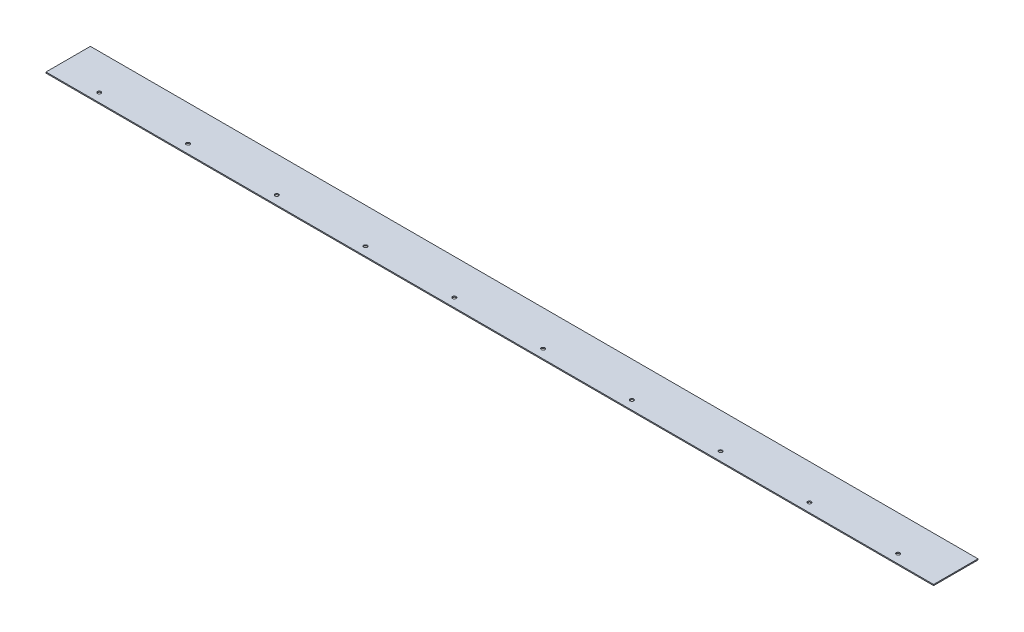
ISO-10303-21;
HEADER;
FILE_DESCRIPTION(('STEP AP214'),'2;1');
FILE_NAME('part.step','',(''),(''),'','','');
FILE_SCHEMA(('AUTOMOTIVE_DESIGN { 1 0 10303 214 1 1 1 1 }'));
ENDSEC;
DATA;
#1=APPLICATION_CONTEXT('core data for automotive mechanical design processes');
#2=APPLICATION_PROTOCOL_DEFINITION('international standard','automotive_design',2000,#1);
#3=PRODUCT_CONTEXT('',#1,'mechanical');
#4=PRODUCT('Part','Part','',(#3));
#5=PRODUCT_RELATED_PRODUCT_CATEGORY('part','',(#4));
#6=PRODUCT_DEFINITION_FORMATION('','',#4);
#7=PRODUCT_DEFINITION_CONTEXT('part definition',#1,'design');
#8=PRODUCT_DEFINITION('design','',#6,#7);
#9=PRODUCT_DEFINITION_SHAPE('','',#8);
#10=(LENGTH_UNIT() NAMED_UNIT(*) SI_UNIT(.MILLI.,.METRE.));
#11=(NAMED_UNIT(*) PLANE_ANGLE_UNIT() SI_UNIT($,.RADIAN.));
#12=(NAMED_UNIT(*) SI_UNIT($,.STERADIAN.) SOLID_ANGLE_UNIT());
#13=UNCERTAINTY_MEASURE_WITH_UNIT(LENGTH_MEASURE(1.E-05),#10,'distance_accuracy_value','');
#14=(GEOMETRIC_REPRESENTATION_CONTEXT(3) GLOBAL_UNCERTAINTY_ASSIGNED_CONTEXT((#13)) GLOBAL_UNIT_ASSIGNED_CONTEXT((#10,
#11,#12)) REPRESENTATION_CONTEXT('',''));
#15=CARTESIAN_POINT('',(0.,0.,0.));
#16=DIRECTION('',(0.,0.,1.));
#17=DIRECTION('',(1.,0.,0.));
#18=AXIS2_PLACEMENT_3D('',#15,#16,#17);
#19=CARTESIAN_POINT('',(500.,-1.2,25.));
#20=DIRECTION('',(1.,0.,0.));
#21=DIRECTION('',(0.,0.,-1.));
#22=AXIS2_PLACEMENT_3D('',#19,#20,#21);
#23=PLANE('',#22);
#24=DIRECTION('',(0.,0.,-1.));
#25=VECTOR('',#24,1.);
#26=CARTESIAN_POINT('',(500.,0.,25.));
#27=LINE('',#26,#25);
#28=CARTESIAN_POINT('',(500.,0.,25.));
#29=VERTEX_POINT('',#28);
#30=CARTESIAN_POINT('',(500.,0.,-25.));
#31=VERTEX_POINT('',#30);
#32=EDGE_CURVE('E103',#29,#31,#27,.T.);
#33=ORIENTED_EDGE('',*,*,#32,.F.);
#34=DIRECTION('',(0.,1.,0.));
#35=VECTOR('',#34,1.);
#36=CARTESIAN_POINT('',(500.,-1.2,25.));
#37=LINE('',#36,#35);
#38=CARTESIAN_POINT('',(500.,-1.2,25.));
#39=VERTEX_POINT('',#38);
#40=EDGE_CURVE('E11',#39,#29,#37,.T.);
#41=ORIENTED_EDGE('',*,*,#40,.F.);
#42=DIRECTION('',(0.,0.,-1.));
#43=VECTOR('',#42,1.);
#44=CARTESIAN_POINT('',(500.,-1.2,25.));
#45=LINE('',#44,#43);
#46=CARTESIAN_POINT('',(500.,-1.2,-25.));
#47=VERTEX_POINT('',#46);
#48=EDGE_CURVE('E96',#39,#47,#45,.T.);
#49=ORIENTED_EDGE('',*,*,#48,.T.);
#50=DIRECTION('',(0.,1.,0.));
#51=VECTOR('',#50,1.);
#52=CARTESIAN_POINT('',(500.,-1.2,-25.));
#53=LINE('',#52,#51);
#54=EDGE_CURVE('E41',#47,#31,#53,.T.);
#55=ORIENTED_EDGE('',*,*,#54,.T.);
#56=EDGE_LOOP('',(#33,#41,#49,#55));
#57=FACE_BOUND('',#56,.T.);
#58=ADVANCED_FACE('F38',(#57),#23,.T.);
#59=CARTESIAN_POINT('',(-500.,-1.2,25.));
#60=DIRECTION('',(0.,0.,1.));
#61=DIRECTION('',(1.,0.,0.));
#62=AXIS2_PLACEMENT_3D('',#59,#60,#61);
#63=PLANE('',#62);
#64=DIRECTION('',(1.,0.,0.));
#65=VECTOR('',#64,1.);
#66=CARTESIAN_POINT('',(-500.,0.,25.));
#67=LINE('',#66,#65);
#68=CARTESIAN_POINT('',(-500.,0.,25.));
#69=VERTEX_POINT('',#68);
#70=EDGE_CURVE('E98',#69,#29,#67,.T.);
#71=ORIENTED_EDGE('',*,*,#70,.F.);
#72=DIRECTION('',(0.,1.,0.));
#73=VECTOR('',#72,1.);
#74=CARTESIAN_POINT('',(-500.,-1.2,25.));
#75=LINE('',#74,#73);
#76=CARTESIAN_POINT('',(-500.,-1.2,25.));
#77=VERTEX_POINT('',#76);
#78=EDGE_CURVE('E47',#77,#69,#75,.T.);
#79=ORIENTED_EDGE('',*,*,#78,.F.);
#80=DIRECTION('',(1.,0.,0.));
#81=VECTOR('',#80,1.);
#82=CARTESIAN_POINT('',(-500.,-1.2,25.));
#83=LINE('',#82,#81);
#84=EDGE_CURVE('E93',#77,#39,#83,.T.);
#85=ORIENTED_EDGE('',*,*,#84,.T.);
#86=ORIENTED_EDGE('',*,*,#40,.T.);
#87=EDGE_LOOP('',(#71,#79,#85,#86));
#88=FACE_BOUND('',#87,.T.);
#89=ADVANCED_FACE('F114',(#88),#63,.T.);
#90=CARTESIAN_POINT('',(-500.,-1.2,25.));
#91=DIRECTION('',(-1.,0.,0.));
#92=DIRECTION('',(0.,0.,1.));
#93=AXIS2_PLACEMENT_3D('',#90,#91,#92);
#94=PLANE('',#93);
#95=DIRECTION('',(0.,0.,1.));
#96=VECTOR('',#95,1.);
#97=CARTESIAN_POINT('',(-500.,0.,25.));
#98=LINE('',#97,#96);
#99=CARTESIAN_POINT('',(-500.,0.,-25.));
#100=VERTEX_POINT('',#99);
#101=EDGE_CURVE('E88',#100,#69,#98,.T.);
#102=ORIENTED_EDGE('',*,*,#101,.F.);
#103=DIRECTION('',(0.,1.,0.));
#104=VECTOR('',#103,1.);
#105=CARTESIAN_POINT('',(-500.,-1.2,-25.));
#106=LINE('',#105,#104);
#107=CARTESIAN_POINT('',(-500.,-1.2,-25.));
#108=VERTEX_POINT('',#107);
#109=EDGE_CURVE('E83',#108,#100,#106,.T.);
#110=ORIENTED_EDGE('',*,*,#109,.F.);
#111=DIRECTION('',(0.,0.,1.));
#112=VECTOR('',#111,1.);
#113=CARTESIAN_POINT('',(-500.,-1.2,25.));
#114=LINE('',#113,#112);
#115=EDGE_CURVE('E86',#108,#77,#114,.T.);
#116=ORIENTED_EDGE('',*,*,#115,.T.);
#117=ORIENTED_EDGE('',*,*,#78,.T.);
#118=EDGE_LOOP('',(#102,#110,#116,#117));
#119=FACE_BOUND('',#118,.T.);
#120=ADVANCED_FACE('F85',(#119),#94,.T.);
#121=CARTESIAN_POINT('',(-500.,-1.2,-25.));
#122=DIRECTION('',(0.,0.,-1.));
#123=DIRECTION('',(-1.,0.,0.));
#124=AXIS2_PLACEMENT_3D('',#121,#122,#123);
#125=PLANE('',#124);
#126=DIRECTION('',(-1.,0.,0.));
#127=VECTOR('',#126,1.);
#128=CARTESIAN_POINT('',(-500.,0.,-25.));
#129=LINE('',#128,#127);
#130=EDGE_CURVE('E106',#31,#100,#129,.T.);
#131=ORIENTED_EDGE('',*,*,#130,.F.);
#132=ORIENTED_EDGE('',*,*,#54,.F.);
#133=DIRECTION('',(-1.,0.,0.));
#134=VECTOR('',#133,1.);
#135=CARTESIAN_POINT('',(-500.,-1.2,-25.));
#136=LINE('',#135,#134);
#137=EDGE_CURVE('E92',#47,#108,#136,.T.);
#138=ORIENTED_EDGE('',*,*,#137,.T.);
#139=ORIENTED_EDGE('',*,*,#109,.T.);
#140=EDGE_LOOP('',(#131,#132,#138,#139));
#141=FACE_BOUND('',#140,.T.);
#142=ADVANCED_FACE('F95',(#141),#125,.T.);
#143=CARTESIAN_POINT('',(0.,-1.2,0.));
#144=DIRECTION('',(0.,-1.,0.));
#145=DIRECTION('',(0.,0.,-1.));
#146=AXIS2_PLACEMENT_3D('',#143,#144,#145);
#147=PLANE('',#146);
#148=CARTESIAN_POINT('',(450.,-1.2,15.));
#149=DIRECTION('',(0.,-1.,0.));
#150=DIRECTION('',(0.,0.,-1.));
#151=AXIS2_PLACEMENT_3D('',#148,#149,#150);
#152=CIRCLE('',#151,2.);
#153=CARTESIAN_POINT('',(450.,-1.2,13.));
#154=VERTEX_POINT('',#153);
#155=EDGE_CURVE('E107',#154,#154,#152,.T.);
#156=ORIENTED_EDGE('',*,*,#155,.F.);
#157=EDGE_LOOP('',(#156));
#158=FACE_BOUND('',#157,.T.);
#159=CARTESIAN_POINT('',(350.,-1.2,15.));
#160=DIRECTION('',(0.,-1.,0.));
#161=DIRECTION('',(0.,0.,-1.));
#162=AXIS2_PLACEMENT_3D('',#159,#160,#161);
#163=CIRCLE('',#162,2.);
#164=CARTESIAN_POINT('',(350.,-1.2,13.));
#165=VERTEX_POINT('',#164);
#166=EDGE_CURVE('E236',#165,#165,#163,.T.);
#167=ORIENTED_EDGE('',*,*,#166,.F.);
#168=EDGE_LOOP('',(#167));
#169=FACE_BOUND('',#168,.T.);
#170=CARTESIAN_POINT('',(250.,-1.2,15.));
#171=DIRECTION('',(0.,-1.,0.));
#172=DIRECTION('',(0.,0.,-1.));
#173=AXIS2_PLACEMENT_3D('',#170,#171,#172);
#174=CIRCLE('',#173,2.);
#175=CARTESIAN_POINT('',(250.,-1.2,13.));
#176=VERTEX_POINT('',#175);
#177=EDGE_CURVE('E233',#176,#176,#174,.T.);
#178=ORIENTED_EDGE('',*,*,#177,.F.);
#179=EDGE_LOOP('',(#178));
#180=FACE_BOUND('',#179,.T.);
#181=CARTESIAN_POINT('',(150.,-1.2,15.));
#182=DIRECTION('',(0.,-1.,0.));
#183=DIRECTION('',(0.,0.,-1.));
#184=AXIS2_PLACEMENT_3D('',#181,#182,#183);
#185=CIRCLE('',#184,2.);
#186=CARTESIAN_POINT('',(150.,-1.2,13.));
#187=VERTEX_POINT('',#186);
#188=EDGE_CURVE('E230',#187,#187,#185,.T.);
#189=ORIENTED_EDGE('',*,*,#188,.F.);
#190=EDGE_LOOP('',(#189));
#191=FACE_BOUND('',#190,.T.);
#192=CARTESIAN_POINT('',(49.9999999999999,-1.2,15.));
#193=DIRECTION('',(0.,-1.,0.));
#194=DIRECTION('',(0.,0.,-1.));
#195=AXIS2_PLACEMENT_3D('',#192,#193,#194);
#196=CIRCLE('',#195,2.);
#197=CARTESIAN_POINT('',(49.9999999999999,-1.2,13.));
#198=VERTEX_POINT('',#197);
#199=EDGE_CURVE('E227',#198,#198,#196,.T.);
#200=ORIENTED_EDGE('',*,*,#199,.F.);
#201=EDGE_LOOP('',(#200));
#202=FACE_BOUND('',#201,.T.);
#203=CARTESIAN_POINT('',(-50.0000000000001,-1.2,15.));
#204=DIRECTION('',(0.,-1.,0.));
#205=DIRECTION('',(0.,0.,-1.));
#206=AXIS2_PLACEMENT_3D('',#203,#204,#205);
#207=CIRCLE('',#206,2.);
#208=CARTESIAN_POINT('',(-50.0000000000001,-1.2,13.));
#209=VERTEX_POINT('',#208);
#210=EDGE_CURVE('E224',#209,#209,#207,.T.);
#211=ORIENTED_EDGE('',*,*,#210,.F.);
#212=EDGE_LOOP('',(#211));
#213=FACE_BOUND('',#212,.T.);
#214=CARTESIAN_POINT('',(-150.,-1.2,15.));
#215=DIRECTION('',(0.,-1.,0.));
#216=DIRECTION('',(0.,0.,-1.));
#217=AXIS2_PLACEMENT_3D('',#214,#215,#216);
#218=CIRCLE('',#217,2.);
#219=CARTESIAN_POINT('',(-150.,-1.2,13.));
#220=VERTEX_POINT('',#219);
#221=EDGE_CURVE('E221',#220,#220,#218,.T.);
#222=ORIENTED_EDGE('',*,*,#221,.F.);
#223=EDGE_LOOP('',(#222));
#224=FACE_BOUND('',#223,.T.);
#225=CARTESIAN_POINT('',(-250.,-1.2,15.));
#226=DIRECTION('',(0.,-1.,0.));
#227=DIRECTION('',(0.,0.,-1.));
#228=AXIS2_PLACEMENT_3D('',#225,#226,#227);
#229=CIRCLE('',#228,2.);
#230=CARTESIAN_POINT('',(-250.,-1.2,13.));
#231=VERTEX_POINT('',#230);
#232=EDGE_CURVE('E218',#231,#231,#229,.T.);
#233=ORIENTED_EDGE('',*,*,#232,.F.);
#234=EDGE_LOOP('',(#233));
#235=FACE_BOUND('',#234,.T.);
#236=CARTESIAN_POINT('',(-450.,-1.2,15.));
#237=DIRECTION('',(0.,-1.,0.));
#238=DIRECTION('',(0.,0.,-1.));
#239=AXIS2_PLACEMENT_3D('',#236,#237,#238);
#240=CIRCLE('',#239,2.);
#241=CARTESIAN_POINT('',(-450.,-1.2,13.));
#242=VERTEX_POINT('',#241);
#243=EDGE_CURVE('E180',#242,#242,#240,.T.);
#244=ORIENTED_EDGE('',*,*,#243,.F.);
#245=EDGE_LOOP('',(#244));
#246=FACE_BOUND('',#245,.T.);
#247=CARTESIAN_POINT('',(-350.,-1.2,15.));
#248=DIRECTION('',(0.,-1.,0.));
#249=DIRECTION('',(0.,0.,-1.));
#250=AXIS2_PLACEMENT_3D('',#247,#248,#249);
#251=CIRCLE('',#250,2.);
#252=CARTESIAN_POINT('',(-350.,-1.2,13.));
#253=VERTEX_POINT('',#252);
#254=EDGE_CURVE('E189',#253,#253,#251,.T.);
#255=ORIENTED_EDGE('',*,*,#254,.F.);
#256=EDGE_LOOP('',(#255));
#257=FACE_BOUND('',#256,.T.);
#258=ORIENTED_EDGE('',*,*,#48,.F.);
#259=ORIENTED_EDGE('',*,*,#84,.F.);
#260=ORIENTED_EDGE('',*,*,#115,.F.);
#261=ORIENTED_EDGE('',*,*,#137,.F.);
#262=EDGE_LOOP('',(#258,#259,#260,#261));
#263=FACE_BOUND('',#262,.T.);
#264=ADVANCED_FACE('F91',(#158,#169,#180,#191,#202,#213,#224,#235,#246,#257,#263),#147,.T.);
#265=CARTESIAN_POINT('',(0.,0.,0.));
#266=DIRECTION('',(0.,-1.,0.));
#267=DIRECTION('',(0.,0.,-1.));
#268=AXIS2_PLACEMENT_3D('',#265,#266,#267);
#269=PLANE('',#268);
#270=CARTESIAN_POINT('',(450.,0.,15.));
#271=DIRECTION('',(0.,1.,0.));
#272=DIRECTION('',(0.,0.,1.));
#273=AXIS2_PLACEMENT_3D('',#270,#271,#272);
#274=CIRCLE('',#273,2.);
#275=CARTESIAN_POINT('',(450.,0.,17.));
#276=VERTEX_POINT('',#275);
#277=EDGE_CURVE('E212',#276,#276,#274,.T.);
#278=ORIENTED_EDGE('',*,*,#277,.F.);
#279=EDGE_LOOP('',(#278));
#280=FACE_BOUND('',#279,.T.);
#281=CARTESIAN_POINT('',(350.,0.,15.));
#282=DIRECTION('',(0.,1.,0.));
#283=DIRECTION('',(0.,0.,1.));
#284=AXIS2_PLACEMENT_3D('',#281,#282,#283);
#285=CIRCLE('',#284,2.);
#286=CARTESIAN_POINT('',(350.,0.,17.));
#287=VERTEX_POINT('',#286);
#288=EDGE_CURVE('E209',#287,#287,#285,.T.);
#289=ORIENTED_EDGE('',*,*,#288,.F.);
#290=EDGE_LOOP('',(#289));
#291=FACE_BOUND('',#290,.T.);
#292=CARTESIAN_POINT('',(250.,0.,15.));
#293=DIRECTION('',(0.,1.,0.));
#294=DIRECTION('',(0.,0.,1.));
#295=AXIS2_PLACEMENT_3D('',#292,#293,#294);
#296=CIRCLE('',#295,2.);
#297=CARTESIAN_POINT('',(250.,0.,17.));
#298=VERTEX_POINT('',#297);
#299=EDGE_CURVE('E206',#298,#298,#296,.T.);
#300=ORIENTED_EDGE('',*,*,#299,.F.);
#301=EDGE_LOOP('',(#300));
#302=FACE_BOUND('',#301,.T.);
#303=CARTESIAN_POINT('',(150.,0.,15.));
#304=DIRECTION('',(0.,1.,0.));
#305=DIRECTION('',(0.,0.,1.));
#306=AXIS2_PLACEMENT_3D('',#303,#304,#305);
#307=CIRCLE('',#306,2.);
#308=CARTESIAN_POINT('',(150.,0.,17.));
#309=VERTEX_POINT('',#308);
#310=EDGE_CURVE('E203',#309,#309,#307,.T.);
#311=ORIENTED_EDGE('',*,*,#310,.F.);
#312=EDGE_LOOP('',(#311));
#313=FACE_BOUND('',#312,.T.);
#314=CARTESIAN_POINT('',(49.9999999999999,0.,15.));
#315=DIRECTION('',(0.,1.,0.));
#316=DIRECTION('',(0.,0.,1.));
#317=AXIS2_PLACEMENT_3D('',#314,#315,#316);
#318=CIRCLE('',#317,2.);
#319=CARTESIAN_POINT('',(49.9999999999999,0.,17.));
#320=VERTEX_POINT('',#319);
#321=EDGE_CURVE('E200',#320,#320,#318,.T.);
#322=ORIENTED_EDGE('',*,*,#321,.F.);
#323=EDGE_LOOP('',(#322));
#324=FACE_BOUND('',#323,.T.);
#325=CARTESIAN_POINT('',(-50.0000000000001,0.,15.));
#326=DIRECTION('',(0.,1.,0.));
#327=DIRECTION('',(0.,0.,1.));
#328=AXIS2_PLACEMENT_3D('',#325,#326,#327);
#329=CIRCLE('',#328,2.);
#330=CARTESIAN_POINT('',(-50.0000000000001,0.,17.));
#331=VERTEX_POINT('',#330);
#332=EDGE_CURVE('E197',#331,#331,#329,.T.);
#333=ORIENTED_EDGE('',*,*,#332,.F.);
#334=EDGE_LOOP('',(#333));
#335=FACE_BOUND('',#334,.T.);
#336=CARTESIAN_POINT('',(-150.,0.,15.));
#337=DIRECTION('',(0.,1.,0.));
#338=DIRECTION('',(0.,0.,1.));
#339=AXIS2_PLACEMENT_3D('',#336,#337,#338);
#340=CIRCLE('',#339,2.);
#341=CARTESIAN_POINT('',(-150.,0.,17.));
#342=VERTEX_POINT('',#341);
#343=EDGE_CURVE('E192',#342,#342,#340,.T.);
#344=ORIENTED_EDGE('',*,*,#343,.F.);
#345=EDGE_LOOP('',(#344));
#346=FACE_BOUND('',#345,.T.);
#347=CARTESIAN_POINT('',(-250.,0.,15.));
#348=DIRECTION('',(0.,1.,0.));
#349=DIRECTION('',(0.,0.,1.));
#350=AXIS2_PLACEMENT_3D('',#347,#348,#349);
#351=CIRCLE('',#350,2.);
#352=CARTESIAN_POINT('',(-250.,0.,17.));
#353=VERTEX_POINT('',#352);
#354=EDGE_CURVE('E186',#353,#353,#351,.T.);
#355=ORIENTED_EDGE('',*,*,#354,.F.);
#356=EDGE_LOOP('',(#355));
#357=FACE_BOUND('',#356,.T.);
#358=CARTESIAN_POINT('',(-450.,0.,15.));
#359=DIRECTION('',(0.,1.,0.));
#360=DIRECTION('',(0.,0.,1.));
#361=AXIS2_PLACEMENT_3D('',#358,#359,#360);
#362=CIRCLE('',#361,2.);
#363=CARTESIAN_POINT('',(-450.,0.,17.));
#364=VERTEX_POINT('',#363);
#365=EDGE_CURVE('E183',#364,#364,#362,.T.);
#366=ORIENTED_EDGE('',*,*,#365,.F.);
#367=EDGE_LOOP('',(#366));
#368=FACE_BOUND('',#367,.T.);
#369=CARTESIAN_POINT('',(-350.,0.,15.));
#370=DIRECTION('',(0.,1.,0.));
#371=DIRECTION('',(0.,0.,1.));
#372=AXIS2_PLACEMENT_3D('',#369,#370,#371);
#373=CIRCLE('',#372,2.);
#374=CARTESIAN_POINT('',(-350.,0.,17.));
#375=VERTEX_POINT('',#374);
#376=EDGE_CURVE('E185',#375,#375,#373,.T.);
#377=ORIENTED_EDGE('',*,*,#376,.F.);
#378=EDGE_LOOP('',(#377));
#379=FACE_BOUND('',#378,.T.);
#380=ORIENTED_EDGE('',*,*,#32,.T.);
#381=ORIENTED_EDGE('',*,*,#130,.T.);
#382=ORIENTED_EDGE('',*,*,#101,.T.);
#383=ORIENTED_EDGE('',*,*,#70,.T.);
#384=EDGE_LOOP('',(#380,#381,#382,#383));
#385=FACE_BOUND('',#384,.T.);
#386=ADVANCED_FACE('F113',(#280,#291,#302,#313,#324,#335,#346,#357,#368,#379,#385),#269,.F.);
#387=CARTESIAN_POINT('',(-350.,-10.,15.));
#388=DIRECTION('',(0.,1.,0.));
#389=DIRECTION('',(0.,0.,1.));
#390=AXIS2_PLACEMENT_3D('',#387,#388,#389);
#391=CYLINDRICAL_SURFACE('',#390,2.);
#392=ORIENTED_EDGE('',*,*,#254,.T.);
#393=EDGE_LOOP('',(#392));
#394=FACE_BOUND('',#393,.T.);
#395=ORIENTED_EDGE('',*,*,#376,.T.);
#396=EDGE_LOOP('',(#395));
#397=FACE_BOUND('',#396,.T.);
#398=ADVANCED_FACE('F132',(#394,#397),#391,.F.);
#399=CARTESIAN_POINT('',(-450.,-10.,15.));
#400=DIRECTION('',(0.,1.,0.));
#401=DIRECTION('',(0.,0.,1.));
#402=AXIS2_PLACEMENT_3D('',#399,#400,#401);
#403=CYLINDRICAL_SURFACE('',#402,2.);
#404=ORIENTED_EDGE('',*,*,#243,.T.);
#405=EDGE_LOOP('',(#404));
#406=FACE_BOUND('',#405,.T.);
#407=ORIENTED_EDGE('',*,*,#365,.T.);
#408=EDGE_LOOP('',(#407));
#409=FACE_BOUND('',#408,.T.);
#410=ADVANCED_FACE('F139',(#406,#409),#403,.F.);
#411=CARTESIAN_POINT('',(-250.,-10.,15.));
#412=DIRECTION('',(0.,1.,0.));
#413=DIRECTION('',(0.,0.,1.));
#414=AXIS2_PLACEMENT_3D('',#411,#412,#413);
#415=CYLINDRICAL_SURFACE('',#414,2.);
#416=ORIENTED_EDGE('',*,*,#232,.T.);
#417=EDGE_LOOP('',(#416));
#418=FACE_BOUND('',#417,.T.);
#419=ORIENTED_EDGE('',*,*,#354,.T.);
#420=EDGE_LOOP('',(#419));
#421=FACE_BOUND('',#420,.T.);
#422=ADVANCED_FACE('F168',(#418,#421),#415,.F.);
#423=CARTESIAN_POINT('',(-150.,-10.,15.));
#424=DIRECTION('',(0.,1.,0.));
#425=DIRECTION('',(0.,0.,1.));
#426=AXIS2_PLACEMENT_3D('',#423,#424,#425);
#427=CYLINDRICAL_SURFACE('',#426,2.);
#428=ORIENTED_EDGE('',*,*,#221,.T.);
#429=EDGE_LOOP('',(#428));
#430=FACE_BOUND('',#429,.T.);
#431=ORIENTED_EDGE('',*,*,#343,.T.);
#432=EDGE_LOOP('',(#431));
#433=FACE_BOUND('',#432,.T.);
#434=ADVANCED_FACE('F164',(#430,#433),#427,.F.);
#435=CARTESIAN_POINT('',(-50.0000000000001,-10.,15.));
#436=DIRECTION('',(0.,1.,0.));
#437=DIRECTION('',(0.,0.,1.));
#438=AXIS2_PLACEMENT_3D('',#435,#436,#437);
#439=CYLINDRICAL_SURFACE('',#438,2.);
#440=ORIENTED_EDGE('',*,*,#210,.T.);
#441=EDGE_LOOP('',(#440));
#442=FACE_BOUND('',#441,.T.);
#443=ORIENTED_EDGE('',*,*,#332,.T.);
#444=EDGE_LOOP('',(#443));
#445=FACE_BOUND('',#444,.T.);
#446=ADVANCED_FACE('F160',(#442,#445),#439,.F.);
#447=CARTESIAN_POINT('',(49.9999999999999,-10.,15.));
#448=DIRECTION('',(0.,1.,0.));
#449=DIRECTION('',(0.,0.,1.));
#450=AXIS2_PLACEMENT_3D('',#447,#448,#449);
#451=CYLINDRICAL_SURFACE('',#450,2.);
#452=ORIENTED_EDGE('',*,*,#199,.T.);
#453=EDGE_LOOP('',(#452));
#454=FACE_BOUND('',#453,.T.);
#455=ORIENTED_EDGE('',*,*,#321,.T.);
#456=EDGE_LOOP('',(#455));
#457=FACE_BOUND('',#456,.T.);
#458=ADVANCED_FACE('F156',(#454,#457),#451,.F.);
#459=CARTESIAN_POINT('',(150.,-10.,15.));
#460=DIRECTION('',(0.,1.,0.));
#461=DIRECTION('',(0.,0.,1.));
#462=AXIS2_PLACEMENT_3D('',#459,#460,#461);
#463=CYLINDRICAL_SURFACE('',#462,2.);
#464=ORIENTED_EDGE('',*,*,#188,.T.);
#465=EDGE_LOOP('',(#464));
#466=FACE_BOUND('',#465,.T.);
#467=ORIENTED_EDGE('',*,*,#310,.T.);
#468=EDGE_LOOP('',(#467));
#469=FACE_BOUND('',#468,.T.);
#470=ADVANCED_FACE('F152',(#466,#469),#463,.F.);
#471=CARTESIAN_POINT('',(250.,-10.,15.));
#472=DIRECTION('',(0.,1.,0.));
#473=DIRECTION('',(0.,0.,1.));
#474=AXIS2_PLACEMENT_3D('',#471,#472,#473);
#475=CYLINDRICAL_SURFACE('',#474,2.);
#476=ORIENTED_EDGE('',*,*,#177,.T.);
#477=EDGE_LOOP('',(#476));
#478=FACE_BOUND('',#477,.T.);
#479=ORIENTED_EDGE('',*,*,#299,.T.);
#480=EDGE_LOOP('',(#479));
#481=FACE_BOUND('',#480,.T.);
#482=ADVANCED_FACE('F148',(#478,#481),#475,.F.);
#483=CARTESIAN_POINT('',(350.,-10.,15.));
#484=DIRECTION('',(0.,1.,0.));
#485=DIRECTION('',(0.,0.,1.));
#486=AXIS2_PLACEMENT_3D('',#483,#484,#485);
#487=CYLINDRICAL_SURFACE('',#486,2.);
#488=ORIENTED_EDGE('',*,*,#166,.T.);
#489=EDGE_LOOP('',(#488));
#490=FACE_BOUND('',#489,.T.);
#491=ORIENTED_EDGE('',*,*,#288,.T.);
#492=EDGE_LOOP('',(#491));
#493=FACE_BOUND('',#492,.T.);
#494=ADVANCED_FACE('F144',(#490,#493),#487,.F.);
#495=CARTESIAN_POINT('',(450.,-10.,15.));
#496=DIRECTION('',(0.,1.,0.));
#497=DIRECTION('',(0.,0.,1.));
#498=AXIS2_PLACEMENT_3D('',#495,#496,#497);
#499=CYLINDRICAL_SURFACE('',#498,2.);
#500=ORIENTED_EDGE('',*,*,#155,.T.);
#501=EDGE_LOOP('',(#500));
#502=FACE_BOUND('',#501,.T.);
#503=ORIENTED_EDGE('',*,*,#277,.T.);
#504=EDGE_LOOP('',(#503));
#505=FACE_BOUND('',#504,.T.);
#506=ADVANCED_FACE('F141',(#502,#505),#499,.F.);
#507=CLOSED_SHELL('',(#58,#89,#120,#142,#264,#386,#398,#410,#422,#434,#446,#458,#470,#482,#494,#506));
#508=MANIFOLD_SOLID_BREP('B2',#507);
#509=ADVANCED_BREP_SHAPE_REPRESENTATION('',(#18,#508),#14);
#510=SHAPE_DEFINITION_REPRESENTATION(#9,#509);
ENDSEC;
END-ISO-10303-21;
